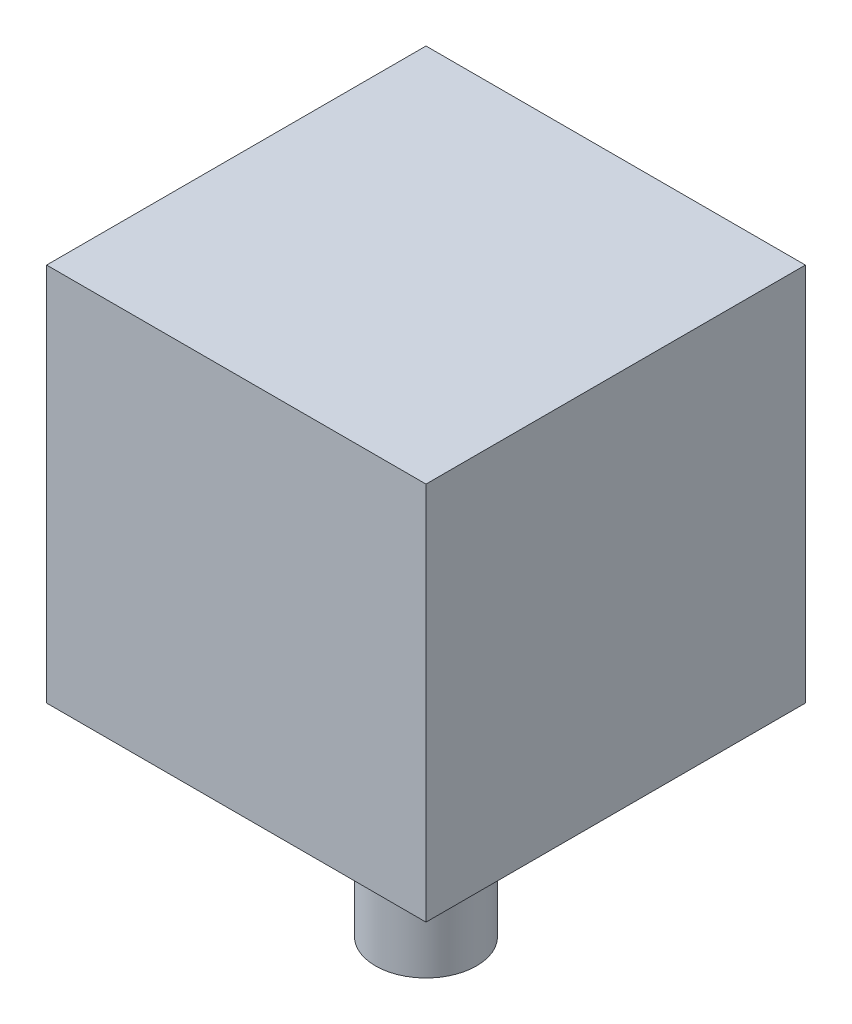
ISO-10303-21;
HEADER;
FILE_DESCRIPTION(('STEP AP214'),'2;1');
FILE_NAME('part.step','',(''),(''),'','','');
FILE_SCHEMA(('AUTOMOTIVE_DESIGN { 1 0 10303 214 1 1 1 1 }'));
ENDSEC;
DATA;
#1=APPLICATION_CONTEXT('core data for automotive mechanical design processes');
#2=APPLICATION_PROTOCOL_DEFINITION('international standard','automotive_design',2000,#1);
#3=PRODUCT_CONTEXT('',#1,'mechanical');
#4=PRODUCT('Part','Part','',(#3));
#5=PRODUCT_RELATED_PRODUCT_CATEGORY('part','',(#4));
#6=PRODUCT_DEFINITION_FORMATION('','',#4);
#7=PRODUCT_DEFINITION_CONTEXT('part definition',#1,'design');
#8=PRODUCT_DEFINITION('design','',#6,#7);
#9=PRODUCT_DEFINITION_SHAPE('','',#8);
#10=(LENGTH_UNIT() NAMED_UNIT(*) SI_UNIT(.MILLI.,.METRE.));
#11=(NAMED_UNIT(*) PLANE_ANGLE_UNIT() SI_UNIT($,.RADIAN.));
#12=(NAMED_UNIT(*) SI_UNIT($,.STERADIAN.) SOLID_ANGLE_UNIT());
#13=UNCERTAINTY_MEASURE_WITH_UNIT(LENGTH_MEASURE(1.E-05),#10,'distance_accuracy_value','');
#14=(GEOMETRIC_REPRESENTATION_CONTEXT(3) GLOBAL_UNCERTAINTY_ASSIGNED_CONTEXT((#13)) GLOBAL_UNIT_ASSIGNED_CONTEXT((#10,
#11,#12)) REPRESENTATION_CONTEXT('',''));
#15=CARTESIAN_POINT('',(0.,0.,0.));
#16=DIRECTION('',(0.,0.,1.));
#17=DIRECTION('',(1.,0.,0.));
#18=AXIS2_PLACEMENT_3D('',#15,#16,#17);
#19=CARTESIAN_POINT('',(-80.,4.,-228.));
#20=DIRECTION('',(0.,-1.,0.));
#21=DIRECTION('',(0.,0.,-1.));
#22=AXIS2_PLACEMENT_3D('',#19,#20,#21);
#23=CYLINDRICAL_SURFACE('',#22,2.00000000000001);
#24=CARTESIAN_POINT('',(-80.,4.,-228.));
#25=DIRECTION('',(0.,1.,0.));
#26=DIRECTION('',(0.,0.,1.));
#27=AXIS2_PLACEMENT_3D('',#24,#25,#26);
#28=CIRCLE('',#27,2.00000000000001);
#29=CARTESIAN_POINT('',(-80.,4.,-226.));
#30=VERTEX_POINT('',#29);
#31=EDGE_CURVE('E45',#30,#30,#28,.F.);
#32=ORIENTED_EDGE('',*,*,#31,.T.);
#33=EDGE_LOOP('',(#32));
#34=FACE_BOUND('',#33,.T.);
#35=CARTESIAN_POINT('',(-80.,-4.,-228.));
#36=DIRECTION('',(0.,1.,0.));
#37=DIRECTION('',(0.,0.,1.));
#38=AXIS2_PLACEMENT_3D('',#35,#36,#37);
#39=CIRCLE('',#38,2.00000000000001);
#40=CARTESIAN_POINT('',(-80.,-4.,-226.));
#41=VERTEX_POINT('',#40);
#42=EDGE_CURVE('E11',#41,#41,#39,.F.);
#43=ORIENTED_EDGE('',*,*,#42,.F.);
#44=EDGE_LOOP('',(#43));
#45=FACE_BOUND('',#44,.T.);
#46=ADVANCED_FACE('F37',(#34,#45),#23,.T.);
#47=CARTESIAN_POINT('',(0.,-4.,0.));
#48=DIRECTION('',(0.,1.,0.));
#49=DIRECTION('',(0.,0.,1.));
#50=AXIS2_PLACEMENT_3D('',#47,#48,#49);
#51=PLANE('',#50);
#52=ORIENTED_EDGE('',*,*,#42,.T.);
#53=EDGE_LOOP('',(#52));
#54=FACE_BOUND('',#53,.T.);
#55=ADVANCED_FACE('F132',(#54),#51,.F.);
#56=CARTESIAN_POINT('',(0.,19.,-220.5));
#57=DIRECTION('',(0.,0.,1.));
#58=DIRECTION('',(1.,0.,0.));
#59=AXIS2_PLACEMENT_3D('',#56,#57,#58);
#60=PLANE('',#59);
#61=DIRECTION('',(-1.,0.,0.));
#62=VECTOR('',#61,1.);
#63=CARTESIAN_POINT('',(0.,4.,-220.5));
#64=LINE('',#63,#62);
#65=CARTESIAN_POINT('',(-72.5,4.,-220.5));
#66=VERTEX_POINT('',#65);
#67=CARTESIAN_POINT('',(-87.5,4.,-220.5));
#68=VERTEX_POINT('',#67);
#69=EDGE_CURVE('E104',#66,#68,#64,.T.);
#70=ORIENTED_EDGE('',*,*,#69,.F.);
#71=DIRECTION('',(0.,-1.,0.));
#72=VECTOR('',#71,1.);
#73=CARTESIAN_POINT('',(-72.5,19.,-220.5));
#74=LINE('',#73,#72);
#75=CARTESIAN_POINT('',(-72.5,19.,-220.5));
#76=VERTEX_POINT('',#75);
#77=EDGE_CURVE('E53',#76,#66,#74,.T.);
#78=ORIENTED_EDGE('',*,*,#77,.F.);
#79=DIRECTION('',(-1.,0.,0.));
#80=VECTOR('',#79,1.);
#81=CARTESIAN_POINT('',(0.,19.,-220.5));
#82=LINE('',#81,#80);
#83=CARTESIAN_POINT('',(-87.5,19.,-220.5));
#84=VERTEX_POINT('',#83);
#85=EDGE_CURVE('E98',#76,#84,#82,.T.);
#86=ORIENTED_EDGE('',*,*,#85,.T.);
#87=DIRECTION('',(0.,-1.,0.));
#88=VECTOR('',#87,1.);
#89=CARTESIAN_POINT('',(-87.5,19.,-220.5));
#90=LINE('',#89,#88);
#91=EDGE_CURVE('E95',#84,#68,#90,.T.);
#92=ORIENTED_EDGE('',*,*,#91,.T.);
#93=EDGE_LOOP('',(#70,#78,#86,#92));
#94=FACE_BOUND('',#93,.T.);
#95=ADVANCED_FACE('F123',(#94),#60,.T.);
#96=CARTESIAN_POINT('',(-72.5,19.,0.));
#97=DIRECTION('',(1.,0.,0.));
#98=DIRECTION('',(0.,0.,-1.));
#99=AXIS2_PLACEMENT_3D('',#96,#97,#98);
#100=PLANE('',#99);
#101=DIRECTION('',(0.,0.,1.));
#102=VECTOR('',#101,1.);
#103=CARTESIAN_POINT('',(-72.5,4.,0.));
#104=LINE('',#103,#102);
#105=CARTESIAN_POINT('',(-72.5,4.,-235.5));
#106=VERTEX_POINT('',#105);
#107=EDGE_CURVE('E100',#106,#66,#104,.T.);
#108=ORIENTED_EDGE('',*,*,#107,.F.);
#109=DIRECTION('',(0.,-1.,0.));
#110=VECTOR('',#109,1.);
#111=CARTESIAN_POINT('',(-72.5,19.,-235.5));
#112=LINE('',#111,#110);
#113=CARTESIAN_POINT('',(-72.5,19.,-235.5));
#114=VERTEX_POINT('',#113);
#115=EDGE_CURVE('E69',#114,#106,#112,.T.);
#116=ORIENTED_EDGE('',*,*,#115,.F.);
#117=DIRECTION('',(0.,0.,1.));
#118=VECTOR('',#117,1.);
#119=CARTESIAN_POINT('',(-72.5,19.,0.));
#120=LINE('',#119,#118);
#121=EDGE_CURVE('E86',#114,#76,#120,.T.);
#122=ORIENTED_EDGE('',*,*,#121,.T.);
#123=ORIENTED_EDGE('',*,*,#77,.T.);
#124=EDGE_LOOP('',(#108,#116,#122,#123));
#125=FACE_BOUND('',#124,.T.);
#126=ADVANCED_FACE('F124',(#125),#100,.T.);
#127=CARTESIAN_POINT('',(0.,19.,-235.5));
#128=DIRECTION('',(0.,0.,1.));
#129=DIRECTION('',(1.,0.,0.));
#130=AXIS2_PLACEMENT_3D('',#127,#128,#129);
#131=PLANE('',#130);
#132=DIRECTION('',(-1.,0.,0.));
#133=VECTOR('',#132,1.);
#134=CARTESIAN_POINT('',(0.,4.,-235.5));
#135=LINE('',#134,#133);
#136=CARTESIAN_POINT('',(-87.5,4.,-235.5));
#137=VERTEX_POINT('',#136);
#138=EDGE_CURVE('E91',#106,#137,#135,.T.);
#139=ORIENTED_EDGE('',*,*,#138,.T.);
#140=DIRECTION('',(0.,-1.,0.));
#141=VECTOR('',#140,1.);
#142=CARTESIAN_POINT('',(-87.5,19.,-235.5));
#143=LINE('',#142,#141);
#144=CARTESIAN_POINT('',(-87.5,19.,-235.5));
#145=VERTEX_POINT('',#144);
#146=EDGE_CURVE('E89',#145,#137,#143,.T.);
#147=ORIENTED_EDGE('',*,*,#146,.F.);
#148=DIRECTION('',(-1.,0.,0.));
#149=VECTOR('',#148,1.);
#150=CARTESIAN_POINT('',(0.,19.,-235.5));
#151=LINE('',#150,#149);
#152=EDGE_CURVE('E83',#114,#145,#151,.T.);
#153=ORIENTED_EDGE('',*,*,#152,.F.);
#154=ORIENTED_EDGE('',*,*,#115,.T.);
#155=EDGE_LOOP('',(#139,#147,#153,#154));
#156=FACE_BOUND('',#155,.T.);
#157=ADVANCED_FACE('F90',(#156),#131,.F.);
#158=CARTESIAN_POINT('',(-87.5,19.,0.));
#159=DIRECTION('',(1.,0.,0.));
#160=DIRECTION('',(0.,0.,-1.));
#161=AXIS2_PLACEMENT_3D('',#158,#159,#160);
#162=PLANE('',#161);
#163=DIRECTION('',(0.,0.,1.));
#164=VECTOR('',#163,1.);
#165=CARTESIAN_POINT('',(-87.5,4.,0.));
#166=LINE('',#165,#164);
#167=EDGE_CURVE('E107',#137,#68,#166,.T.);
#168=ORIENTED_EDGE('',*,*,#167,.T.);
#169=ORIENTED_EDGE('',*,*,#91,.F.);
#170=DIRECTION('',(0.,0.,1.));
#171=VECTOR('',#170,1.);
#172=CARTESIAN_POINT('',(-87.5,19.,0.));
#173=LINE('',#172,#171);
#174=EDGE_CURVE('E80',#145,#84,#173,.T.);
#175=ORIENTED_EDGE('',*,*,#174,.F.);
#176=ORIENTED_EDGE('',*,*,#146,.T.);
#177=EDGE_LOOP('',(#168,#169,#175,#176));
#178=FACE_BOUND('',#177,.T.);
#179=ADVANCED_FACE('F97',(#178),#162,.F.);
#180=CARTESIAN_POINT('',(0.,19.,0.));
#181=DIRECTION('',(0.,1.,0.));
#182=DIRECTION('',(0.,0.,1.));
#183=AXIS2_PLACEMENT_3D('',#180,#181,#182);
#184=PLANE('',#183);
#185=ORIENTED_EDGE('',*,*,#85,.F.);
#186=ORIENTED_EDGE('',*,*,#121,.F.);
#187=ORIENTED_EDGE('',*,*,#152,.T.);
#188=ORIENTED_EDGE('',*,*,#174,.T.);
#189=EDGE_LOOP('',(#185,#186,#187,#188));
#190=FACE_BOUND('',#189,.T.);
#191=ADVANCED_FACE('F85',(#190),#184,.T.);
#192=CARTESIAN_POINT('',(0.,4.,0.));
#193=DIRECTION('',(0.,1.,0.));
#194=DIRECTION('',(0.,0.,1.));
#195=AXIS2_PLACEMENT_3D('',#192,#193,#194);
#196=PLANE('',#195);
#197=ORIENTED_EDGE('',*,*,#31,.F.);
#198=EDGE_LOOP('',(#197));
#199=FACE_BOUND('',#198,.T.);
#200=ORIENTED_EDGE('',*,*,#69,.T.);
#201=ORIENTED_EDGE('',*,*,#167,.F.);
#202=ORIENTED_EDGE('',*,*,#138,.F.);
#203=ORIENTED_EDGE('',*,*,#107,.T.);
#204=EDGE_LOOP('',(#200,#201,#202,#203));
#205=FACE_BOUND('',#204,.T.);
#206=ADVANCED_FACE('F119',(#199,#205),#196,.F.);
#207=CLOSED_SHELL('',(#46,#55,#95,#126,#157,#179,#191,#206));
#208=MANIFOLD_SOLID_BREP('B2',#207);
#209=ADVANCED_BREP_SHAPE_REPRESENTATION('',(#18,#208),#14);
#210=SHAPE_DEFINITION_REPRESENTATION(#9,#209);
ENDSEC;
END-ISO-10303-21;
